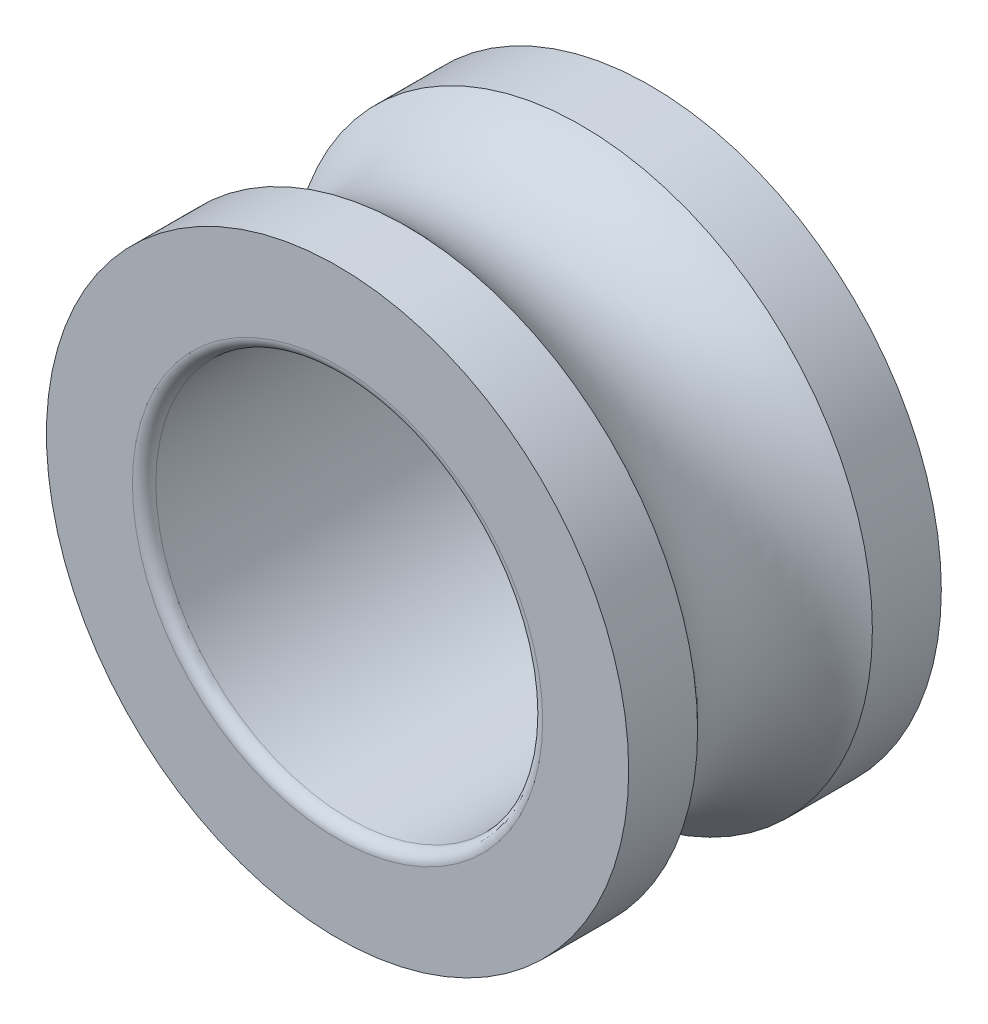
ISO-10303-21;
HEADER;
FILE_DESCRIPTION(('STEP AP214'),'2;1');
FILE_NAME('part.step','',(''),(''),'','','');
FILE_SCHEMA(('AUTOMOTIVE_DESIGN { 1 0 10303 214 1 1 1 1 }'));
ENDSEC;
DATA;
#1=APPLICATION_CONTEXT('core data for automotive mechanical design processes');
#2=APPLICATION_PROTOCOL_DEFINITION('international standard','automotive_design',2000,#1);
#3=PRODUCT_CONTEXT('',#1,'mechanical');
#4=PRODUCT('Part','Part','',(#3));
#5=PRODUCT_RELATED_PRODUCT_CATEGORY('part','',(#4));
#6=PRODUCT_DEFINITION_FORMATION('','',#4);
#7=PRODUCT_DEFINITION_CONTEXT('part definition',#1,'design');
#8=PRODUCT_DEFINITION('design','',#6,#7);
#9=PRODUCT_DEFINITION_SHAPE('','',#8);
#10=(LENGTH_UNIT() NAMED_UNIT(*) SI_UNIT(.MILLI.,.METRE.));
#11=(NAMED_UNIT(*) PLANE_ANGLE_UNIT() SI_UNIT($,.RADIAN.));
#12=(NAMED_UNIT(*) SI_UNIT($,.STERADIAN.) SOLID_ANGLE_UNIT());
#13=UNCERTAINTY_MEASURE_WITH_UNIT(LENGTH_MEASURE(1.E-05),#10,'distance_accuracy_value','');
#14=(GEOMETRIC_REPRESENTATION_CONTEXT(3) GLOBAL_UNCERTAINTY_ASSIGNED_CONTEXT((#13)) GLOBAL_UNIT_ASSIGNED_CONTEXT((#10,
#11,#12)) REPRESENTATION_CONTEXT('',''));
#15=CARTESIAN_POINT('',(0.,0.,0.));
#16=DIRECTION('',(0.,0.,1.));
#17=DIRECTION('',(1.,0.,0.));
#18=AXIS2_PLACEMENT_3D('',#15,#16,#17);
#19=CARTESIAN_POINT('',(0.,7.45,4.));
#20=DIRECTION('',(0.,0.,-1.));
#21=DIRECTION('',(-1.,0.,0.));
#22=AXIS2_PLACEMENT_3D('',#19,#20,#21);
#23=PLANE('',#22);
#24=CARTESIAN_POINT('',(0.,0.,4.));
#25=DIRECTION('',(0.,0.,1.));
#26=DIRECTION('',(1.,0.,0.));
#27=AXIS2_PLACEMENT_3D('',#24,#25,#26);
#28=CIRCLE('',#27,5.25);
#29=CARTESIAN_POINT('',(5.25,0.,4.));
#30=VERTEX_POINT('',#29);
#31=EDGE_CURVE('E10',#30,#30,#28,.T.);
#32=ORIENTED_EDGE('',*,*,#31,.F.);
#33=EDGE_LOOP('',(#32));
#34=FACE_BOUND('',#33,.T.);
#35=CARTESIAN_POINT('',(0.,0.,4.));
#36=DIRECTION('',(0.,0.,1.));
#37=DIRECTION('',(1.,0.,0.));
#38=AXIS2_PLACEMENT_3D('',#35,#36,#37);
#39=CIRCLE('',#38,7.45);
#40=CARTESIAN_POINT('',(7.45,0.,4.));
#41=VERTEX_POINT('',#40);
#42=EDGE_CURVE('E58',#41,#41,#39,.T.);
#43=ORIENTED_EDGE('',*,*,#42,.T.);
#44=EDGE_LOOP('',(#43));
#45=FACE_BOUND('',#44,.T.);
#46=ADVANCED_FACE('F30',(#34,#45),#23,.F.);
#47=CARTESIAN_POINT('',(0.,0.,3.7));
#48=DIRECTION('',(0.,0.,1.));
#49=DIRECTION('',(1.,0.,0.));
#50=AXIS2_PLACEMENT_3D('',#47,#48,#49);
#51=TOROIDAL_SURFACE('',#50,5.25,0.3);
#52=CARTESIAN_POINT('',(0.,0.,3.7));
#53=DIRECTION('',(0.,0.,1.));
#54=DIRECTION('',(1.,0.,0.));
#55=AXIS2_PLACEMENT_3D('',#52,#53,#54);
#56=CIRCLE('',#55,4.95);
#57=CARTESIAN_POINT('',(4.95,0.,3.7));
#58=VERTEX_POINT('',#57);
#59=EDGE_CURVE('E36',#58,#58,#56,.T.);
#60=ORIENTED_EDGE('',*,*,#59,.F.);
#61=EDGE_LOOP('',(#60));
#62=FACE_BOUND('',#61,.T.);
#63=ORIENTED_EDGE('',*,*,#31,.T.);
#64=EDGE_LOOP('',(#63));
#65=FACE_BOUND('',#64,.T.);
#66=ADVANCED_FACE('F95',(#62,#65),#51,.T.);
#67=CARTESIAN_POINT('',(0.,0.,7.41935483870967));
#68=DIRECTION('',(0.,0.,1.));
#69=DIRECTION('',(1.,0.,0.));
#70=AXIS2_PLACEMENT_3D('',#67,#68,#69);
#71=CYLINDRICAL_SURFACE('',#70,4.95);
#72=CARTESIAN_POINT('',(0.,0.,-3.7));
#73=DIRECTION('',(0.,0.,1.));
#74=DIRECTION('',(1.,0.,0.));
#75=AXIS2_PLACEMENT_3D('',#72,#73,#74);
#76=CIRCLE('',#75,4.95);
#77=CARTESIAN_POINT('',(4.95,0.,-3.7));
#78=VERTEX_POINT('',#77);
#79=EDGE_CURVE('E40',#78,#78,#76,.T.);
#80=ORIENTED_EDGE('',*,*,#79,.F.);
#81=EDGE_LOOP('',(#80));
#82=FACE_BOUND('',#81,.T.);
#83=ORIENTED_EDGE('',*,*,#59,.T.);
#84=EDGE_LOOP('',(#83));
#85=FACE_BOUND('',#84,.T.);
#86=ADVANCED_FACE('F90',(#82,#85),#71,.F.);
#87=CARTESIAN_POINT('',(0.,0.,-3.7));
#88=DIRECTION('',(0.,0.,1.));
#89=DIRECTION('',(1.,0.,0.));
#90=AXIS2_PLACEMENT_3D('',#87,#88,#89);
#91=TOROIDAL_SURFACE('',#90,5.25,0.300000000000001);
#92=CARTESIAN_POINT('',(0.,0.,-4.));
#93=DIRECTION('',(0.,0.,1.));
#94=DIRECTION('',(1.,0.,0.));
#95=AXIS2_PLACEMENT_3D('',#92,#93,#94);
#96=CIRCLE('',#95,5.25);
#97=CARTESIAN_POINT('',(5.25,0.,-4.));
#98=VERTEX_POINT('',#97);
#99=EDGE_CURVE('E44',#98,#98,#96,.T.);
#100=ORIENTED_EDGE('',*,*,#99,.F.);
#101=EDGE_LOOP('',(#100));
#102=FACE_BOUND('',#101,.T.);
#103=ORIENTED_EDGE('',*,*,#79,.T.);
#104=EDGE_LOOP('',(#103));
#105=FACE_BOUND('',#104,.T.);
#106=ADVANCED_FACE('F84',(#102,#105),#91,.T.);
#107=CARTESIAN_POINT('',(0.,7.45,-4.));
#108=DIRECTION('',(0.,0.,1.));
#109=DIRECTION('',(1.,0.,0.));
#110=AXIS2_PLACEMENT_3D('',#107,#108,#109);
#111=PLANE('',#110);
#112=CARTESIAN_POINT('',(0.,0.,-4.));
#113=DIRECTION('',(0.,0.,1.));
#114=DIRECTION('',(1.,0.,0.));
#115=AXIS2_PLACEMENT_3D('',#112,#113,#114);
#116=CIRCLE('',#115,7.45);
#117=CARTESIAN_POINT('',(7.45,0.,-4.));
#118=VERTEX_POINT('',#117);
#119=EDGE_CURVE('E49',#118,#118,#116,.T.);
#120=ORIENTED_EDGE('',*,*,#119,.F.);
#121=EDGE_LOOP('',(#120));
#122=FACE_BOUND('',#121,.T.);
#123=ORIENTED_EDGE('',*,*,#99,.T.);
#124=EDGE_LOOP('',(#123));
#125=FACE_BOUND('',#124,.T.);
#126=ADVANCED_FACE('F78',(#122,#125),#111,.F.);
#127=CARTESIAN_POINT('',(0.,0.,7.41935483870967));
#128=DIRECTION('',(0.,0.,1.));
#129=DIRECTION('',(1.,0.,0.));
#130=AXIS2_PLACEMENT_3D('',#127,#128,#129);
#131=CYLINDRICAL_SURFACE('',#130,7.45);
#132=CARTESIAN_POINT('',(0.,0.,-2.23606797749979));
#133=DIRECTION('',(0.,0.,1.));
#134=DIRECTION('',(1.,0.,0.));
#135=AXIS2_PLACEMENT_3D('',#132,#133,#134);
#136=CIRCLE('',#135,7.45);
#137=CARTESIAN_POINT('',(7.45,0.,-2.23606797749979));
#138=VERTEX_POINT('',#137);
#139=EDGE_CURVE('E52',#138,#138,#136,.T.);
#140=ORIENTED_EDGE('',*,*,#139,.F.);
#141=EDGE_LOOP('',(#140));
#142=FACE_BOUND('',#141,.T.);
#143=ORIENTED_EDGE('',*,*,#119,.T.);
#144=EDGE_LOOP('',(#143));
#145=FACE_BOUND('',#144,.T.);
#146=ADVANCED_FACE('F72',(#142,#145),#131,.T.);
#147=CARTESIAN_POINT('',(0.,0.,0.));
#148=DIRECTION('',(0.,0.,1.));
#149=DIRECTION('',(1.,0.,0.));
#150=AXIS2_PLACEMENT_3D('',#147,#148,#149);
#151=TOROIDAL_SURFACE('',#150,9.45,3.);
#152=CARTESIAN_POINT('',(0.,0.,2.23606797749979));
#153=DIRECTION('',(0.,0.,1.));
#154=DIRECTION('',(1.,0.,0.));
#155=AXIS2_PLACEMENT_3D('',#152,#153,#154);
#156=CIRCLE('',#155,7.45);
#157=CARTESIAN_POINT('',(7.45,0.,2.23606797749979));
#158=VERTEX_POINT('',#157);
#159=EDGE_CURVE('E55',#158,#158,#156,.T.);
#160=ORIENTED_EDGE('',*,*,#159,.F.);
#161=EDGE_LOOP('',(#160));
#162=FACE_BOUND('',#161,.T.);
#163=ORIENTED_EDGE('',*,*,#139,.T.);
#164=EDGE_LOOP('',(#163));
#165=FACE_BOUND('',#164,.T.);
#166=ADVANCED_FACE('F66',(#162,#165),#151,.F.);
#167=CARTESIAN_POINT('',(0.,0.,7.41935483870967));
#168=DIRECTION('',(0.,0.,1.));
#169=DIRECTION('',(1.,0.,0.));
#170=AXIS2_PLACEMENT_3D('',#167,#168,#169);
#171=CYLINDRICAL_SURFACE('',#170,7.45);
#172=ORIENTED_EDGE('',*,*,#42,.F.);
#173=EDGE_LOOP('',(#172));
#174=FACE_BOUND('',#173,.T.);
#175=ORIENTED_EDGE('',*,*,#159,.T.);
#176=EDGE_LOOP('',(#175));
#177=FACE_BOUND('',#176,.T.);
#178=ADVANCED_FACE('F63',(#174,#177),#171,.T.);
#179=CLOSED_SHELL('',(#46,#66,#86,#106,#126,#146,#166,#178));
#180=MANIFOLD_SOLID_BREP('B2',#179);
#181=ADVANCED_BREP_SHAPE_REPRESENTATION('',(#18,#180),#14);
#182=SHAPE_DEFINITION_REPRESENTATION(#9,#181);
ENDSEC;
END-ISO-10303-21;
